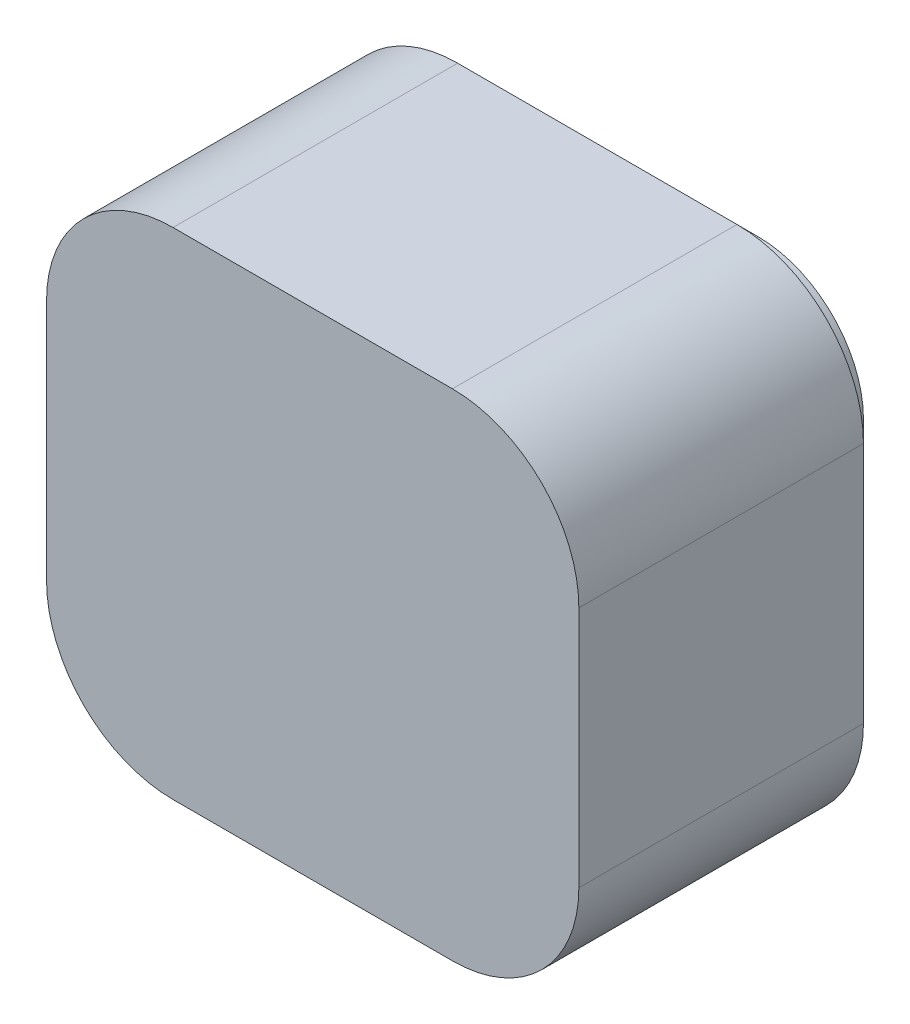
ISO-10303-21;
HEADER;
FILE_DESCRIPTION(('STEP AP214'),'2;1');
FILE_NAME('part.step','',(''),(''),'','','');
FILE_SCHEMA(('AUTOMOTIVE_DESIGN { 1 0 10303 214 1 1 1 1 }'));
ENDSEC;
DATA;
#1=APPLICATION_CONTEXT('core data for automotive mechanical design processes');
#2=APPLICATION_PROTOCOL_DEFINITION('international standard','automotive_design',2000,#1);
#3=PRODUCT_CONTEXT('',#1,'mechanical');
#4=PRODUCT('Part','Part','',(#3));
#5=PRODUCT_RELATED_PRODUCT_CATEGORY('part','',(#4));
#6=PRODUCT_DEFINITION_FORMATION('','',#4);
#7=PRODUCT_DEFINITION_CONTEXT('part definition',#1,'design');
#8=PRODUCT_DEFINITION('design','',#6,#7);
#9=PRODUCT_DEFINITION_SHAPE('','',#8);
#10=(LENGTH_UNIT() NAMED_UNIT(*) SI_UNIT(.MILLI.,.METRE.));
#11=(NAMED_UNIT(*) PLANE_ANGLE_UNIT() SI_UNIT($,.RADIAN.));
#12=(NAMED_UNIT(*) SI_UNIT($,.STERADIAN.) SOLID_ANGLE_UNIT());
#13=UNCERTAINTY_MEASURE_WITH_UNIT(LENGTH_MEASURE(1.E-05),#10,'distance_accuracy_value','');
#14=(GEOMETRIC_REPRESENTATION_CONTEXT(3) GLOBAL_UNCERTAINTY_ASSIGNED_CONTEXT((#13)) GLOBAL_UNIT_ASSIGNED_CONTEXT((#10,
#11,#12)) REPRESENTATION_CONTEXT('',''));
#15=CARTESIAN_POINT('',(0.,0.,0.));
#16=DIRECTION('',(0.,0.,1.));
#17=DIRECTION('',(1.,0.,0.));
#18=AXIS2_PLACEMENT_3D('',#15,#16,#17);
#19=CARTESIAN_POINT('',(-36.5,33.,0.));
#20=DIRECTION('',(0.,0.,-1.));
#21=DIRECTION('',(1.,0.,0.));
#22=AXIS2_PLACEMENT_3D('',#19,#20,#21);
#23=CONICAL_SURFACE('',#22,10.,0.174532925199433);
#24=CARTESIAN_POINT('',(-36.5,33.,0.));
#25=DIRECTION('',(0.,0.,1.));
#26=DIRECTION('',(1.,0.,0.));
#27=AXIS2_PLACEMENT_3D('',#24,#25,#26);
#28=CIRCLE('',#27,10.);
#29=CARTESIAN_POINT('',(-36.4999999999999,43.,0.));
#30=VERTEX_POINT('',#29);
#31=CARTESIAN_POINT('',(-46.5,32.9999999999999,0.));
#32=VERTEX_POINT('',#31);
#33=EDGE_CURVE('E178',#30,#32,#28,.T.);
#34=ORIENTED_EDGE('',*,*,#33,.T.);
#35=DIRECTION('',(-0.17364817766693,0.,-0.984807753012208));
#36=VECTOR('',#35,1.);
#37=CARTESIAN_POINT('',(-46.5,32.9999999999999,0.));
#38=LINE('',#37,#36);
#39=CARTESIAN_POINT('',(-46.1473460385831,32.9999999999999,2.));
#40=VERTEX_POINT('',#39);
#41=EDGE_CURVE('E12',#40,#32,#38,.T.);
#42=ORIENTED_EDGE('',*,*,#41,.F.);
#43=CARTESIAN_POINT('',(-36.5,33.,2.));
#44=DIRECTION('',(0.,0.,1.));
#45=DIRECTION('',(1.,0.,0.));
#46=AXIS2_PLACEMENT_3D('',#43,#44,#45);
#47=CIRCLE('',#46,9.64734603858307);
#48=CARTESIAN_POINT('',(-36.4999999999999,42.6473460385831,2.));
#49=VERTEX_POINT('',#48);
#50=EDGE_CURVE('E210',#49,#40,#47,.T.);
#51=ORIENTED_EDGE('',*,*,#50,.F.);
#52=DIRECTION('',(0.,0.17364817766693,-0.984807753012208));
#53=VECTOR('',#52,1.);
#54=CARTESIAN_POINT('',(-36.4999999999999,43.,0.));
#55=LINE('',#54,#53);
#56=EDGE_CURVE('E212',#49,#30,#55,.T.);
#57=ORIENTED_EDGE('',*,*,#56,.T.);
#58=EDGE_LOOP('',(#34,#42,#51,#57));
#59=FACE_BOUND('',#58,.T.);
#60=ADVANCED_FACE('F45',(#59),#23,.T.);
#61=CARTESIAN_POINT('',(-46.5,10.0000000000001,0.));
#62=DIRECTION('',(-0.984807753012208,0.,0.17364817766693));
#63=DIRECTION('',(0.17364817766693,0.,0.984807753012208));
#64=AXIS2_PLACEMENT_3D('',#61,#62,#63);
#65=PLANE('',#64);
#66=DIRECTION('',(0.,-1.,0.));
#67=VECTOR('',#66,1.);
#68=CARTESIAN_POINT('',(-46.5,10.0000000000001,0.));
#69=LINE('',#68,#67);
#70=CARTESIAN_POINT('',(-46.5,9.99999999999999,0.));
#71=VERTEX_POINT('',#70);
#72=EDGE_CURVE('E141',#32,#71,#69,.T.);
#73=ORIENTED_EDGE('',*,*,#72,.T.);
#74=DIRECTION('',(-0.17364817766693,0.,-0.984807753012208));
#75=VECTOR('',#74,1.);
#76=CARTESIAN_POINT('',(-46.5,9.99999999999999,0.));
#77=LINE('',#76,#75);
#78=CARTESIAN_POINT('',(-46.1473460385831,9.99999999999999,2.));
#79=VERTEX_POINT('',#78);
#80=EDGE_CURVE('E54',#79,#71,#77,.T.);
#81=ORIENTED_EDGE('',*,*,#80,.F.);
#82=DIRECTION('',(0.,1.,0.));
#83=VECTOR('',#82,1.);
#84=CARTESIAN_POINT('',(-46.1473460385831,10.0000000000001,2.));
#85=LINE('',#84,#83);
#86=EDGE_CURVE('E233',#40,#79,#85,.F.);
#87=ORIENTED_EDGE('',*,*,#86,.F.);
#88=ORIENTED_EDGE('',*,*,#41,.T.);
#89=EDGE_LOOP('',(#73,#81,#87,#88));
#90=FACE_BOUND('',#89,.T.);
#91=ADVANCED_FACE('F47',(#90),#65,.T.);
#92=CARTESIAN_POINT('',(-36.5,9.99999999999999,0.));
#93=DIRECTION('',(0.,0.,-1.));
#94=DIRECTION('',(-1.,0.,0.));
#95=AXIS2_PLACEMENT_3D('',#92,#93,#94);
#96=CONICAL_SURFACE('',#95,10.,0.174532925199433);
#97=CARTESIAN_POINT('',(-36.5,9.99999999999999,0.));
#98=DIRECTION('',(0.,0.,1.));
#99=DIRECTION('',(-1.,0.,0.));
#100=AXIS2_PLACEMENT_3D('',#97,#98,#99);
#101=CIRCLE('',#100,10.);
#102=CARTESIAN_POINT('',(-36.4999999999999,0.,0.));
#103=VERTEX_POINT('',#102);
#104=EDGE_CURVE('E193',#71,#103,#101,.T.);
#105=ORIENTED_EDGE('',*,*,#104,.T.);
#106=DIRECTION('',(0.,-0.17364817766693,-0.984807753012208));
#107=VECTOR('',#106,1.);
#108=CARTESIAN_POINT('',(-36.4999999999999,0.,0.));
#109=LINE('',#108,#107);
#110=CARTESIAN_POINT('',(-36.4999999999999,0.352653961416924,2.));
#111=VERTEX_POINT('',#110);
#112=EDGE_CURVE('E227',#111,#103,#109,.T.);
#113=ORIENTED_EDGE('',*,*,#112,.F.);
#114=CARTESIAN_POINT('',(-36.5,9.99999999999999,2.));
#115=DIRECTION('',(0.,0.,1.));
#116=DIRECTION('',(1.,0.,0.));
#117=AXIS2_PLACEMENT_3D('',#114,#115,#116);
#118=CIRCLE('',#117,9.64734603858307);
#119=EDGE_CURVE('E235',#79,#111,#118,.T.);
#120=ORIENTED_EDGE('',*,*,#119,.F.);
#121=ORIENTED_EDGE('',*,*,#80,.T.);
#122=EDGE_LOOP('',(#105,#113,#120,#121));
#123=FACE_BOUND('',#122,.T.);
#124=ADVANCED_FACE('F264',(#123),#96,.T.);
#125=CARTESIAN_POINT('',(-10.0000000000001,0.,0.));
#126=DIRECTION('',(0.,-0.984807753012208,0.17364817766693));
#127=DIRECTION('',(0.,-0.17364817766693,-0.984807753012208));
#128=AXIS2_PLACEMENT_3D('',#125,#126,#127);
#129=PLANE('',#128);
#130=DIRECTION('',(1.,0.,0.));
#131=VECTOR('',#130,1.);
#132=CARTESIAN_POINT('',(-10.0000000000001,0.,0.));
#133=LINE('',#132,#131);
#134=CARTESIAN_POINT('',(-10.0000000000001,0.,0.));
#135=VERTEX_POINT('',#134);
#136=EDGE_CURVE('E196',#103,#135,#133,.T.);
#137=ORIENTED_EDGE('',*,*,#136,.T.);
#138=DIRECTION('',(0.,-0.17364817766693,-0.984807753012208));
#139=VECTOR('',#138,1.);
#140=CARTESIAN_POINT('',(-10.0000000000001,0.,0.));
#141=LINE('',#140,#139);
#142=CARTESIAN_POINT('',(-10.0000000000001,0.352653961416928,2.));
#143=VERTEX_POINT('',#142);
#144=EDGE_CURVE('E224',#143,#135,#141,.T.);
#145=ORIENTED_EDGE('',*,*,#144,.F.);
#146=DIRECTION('',(-1.,0.,0.));
#147=VECTOR('',#146,1.);
#148=CARTESIAN_POINT('',(-10.0000000000001,0.352653961416928,2.));
#149=LINE('',#148,#147);
#150=EDGE_CURVE('E237',#111,#143,#149,.F.);
#151=ORIENTED_EDGE('',*,*,#150,.F.);
#152=ORIENTED_EDGE('',*,*,#112,.T.);
#153=EDGE_LOOP('',(#137,#145,#151,#152));
#154=FACE_BOUND('',#153,.T.);
#155=ADVANCED_FACE('F268',(#154),#129,.T.);
#156=CARTESIAN_POINT('',(-10.,10.,0.));
#157=DIRECTION('',(0.,0.,-1.));
#158=DIRECTION('',(1.,0.,0.));
#159=AXIS2_PLACEMENT_3D('',#156,#157,#158);
#160=CONICAL_SURFACE('',#159,10.,0.174532925199433);
#161=CARTESIAN_POINT('',(-10.,10.,0.));
#162=DIRECTION('',(0.,0.,1.));
#163=DIRECTION('',(1.,0.,0.));
#164=AXIS2_PLACEMENT_3D('',#161,#162,#163);
#165=CIRCLE('',#164,10.);
#166=CARTESIAN_POINT('',(0.,10.0000000000001,0.));
#167=VERTEX_POINT('',#166);
#168=EDGE_CURVE('E199',#135,#167,#165,.T.);
#169=ORIENTED_EDGE('',*,*,#168,.T.);
#170=DIRECTION('',(0.17364817766693,0.,-0.984807753012208));
#171=VECTOR('',#170,1.);
#172=CARTESIAN_POINT('',(0.,10.0000000000001,0.));
#173=LINE('',#172,#171);
#174=CARTESIAN_POINT('',(-0.35265396141693,10.0000000000001,2.));
#175=VERTEX_POINT('',#174);
#176=EDGE_CURVE('E221',#175,#167,#173,.T.);
#177=ORIENTED_EDGE('',*,*,#176,.F.);
#178=CARTESIAN_POINT('',(-10.,10.,2.));
#179=DIRECTION('',(0.,0.,1.));
#180=DIRECTION('',(1.,0.,0.));
#181=AXIS2_PLACEMENT_3D('',#178,#179,#180);
#182=CIRCLE('',#181,9.64734603858307);
#183=EDGE_CURVE('E239',#143,#175,#182,.T.);
#184=ORIENTED_EDGE('',*,*,#183,.F.);
#185=ORIENTED_EDGE('',*,*,#144,.T.);
#186=EDGE_LOOP('',(#169,#177,#184,#185));
#187=FACE_BOUND('',#186,.T.);
#188=ADVANCED_FACE('F271',(#187),#160,.T.);
#189=CARTESIAN_POINT('',(0.,10.0000000000001,0.));
#190=DIRECTION('',(0.984807753012208,0.,0.17364817766693));
#191=DIRECTION('',(0.17364817766693,0.,-0.984807753012208));
#192=AXIS2_PLACEMENT_3D('',#189,#190,#191);
#193=PLANE('',#192);
#194=DIRECTION('',(0.,1.,0.));
#195=VECTOR('',#194,1.);
#196=CARTESIAN_POINT('',(0.,10.0000000000001,0.));
#197=LINE('',#196,#195);
#198=CARTESIAN_POINT('',(0.,32.9999999999999,0.));
#199=VERTEX_POINT('',#198);
#200=EDGE_CURVE('E202',#167,#199,#197,.T.);
#201=ORIENTED_EDGE('',*,*,#200,.T.);
#202=DIRECTION('',(0.17364817766693,0.,-0.984807753012208));
#203=VECTOR('',#202,1.);
#204=CARTESIAN_POINT('',(0.,32.9999999999999,0.));
#205=LINE('',#204,#203);
#206=CARTESIAN_POINT('',(-0.35265396141693,32.9999999999999,2.));
#207=VERTEX_POINT('',#206);
#208=EDGE_CURVE('E218',#207,#199,#205,.T.);
#209=ORIENTED_EDGE('',*,*,#208,.F.);
#210=DIRECTION('',(0.,-1.,0.));
#211=VECTOR('',#210,1.);
#212=CARTESIAN_POINT('',(-0.35265396141693,10.0000000000001,2.));
#213=LINE('',#212,#211);
#214=EDGE_CURVE('E241',#175,#207,#213,.F.);
#215=ORIENTED_EDGE('',*,*,#214,.F.);
#216=ORIENTED_EDGE('',*,*,#176,.T.);
#217=EDGE_LOOP('',(#201,#209,#215,#216));
#218=FACE_BOUND('',#217,.T.);
#219=ADVANCED_FACE('F248',(#218),#193,.T.);
#220=CARTESIAN_POINT('',(-10.,33.,0.));
#221=DIRECTION('',(0.,0.,-1.));
#222=DIRECTION('',(1.,0.,0.));
#223=AXIS2_PLACEMENT_3D('',#220,#221,#222);
#224=CONICAL_SURFACE('',#223,10.,0.174532925199433);
#225=CARTESIAN_POINT('',(-10.,33.,0.));
#226=DIRECTION('',(0.,0.,1.));
#227=DIRECTION('',(1.,0.,0.));
#228=AXIS2_PLACEMENT_3D('',#225,#226,#227);
#229=CIRCLE('',#228,10.);
#230=CARTESIAN_POINT('',(-10.0000000000001,43.,0.));
#231=VERTEX_POINT('',#230);
#232=EDGE_CURVE('E205',#199,#231,#229,.T.);
#233=ORIENTED_EDGE('',*,*,#232,.T.);
#234=DIRECTION('',(0.,0.17364817766693,-0.984807753012208));
#235=VECTOR('',#234,1.);
#236=CARTESIAN_POINT('',(-10.0000000000001,43.,0.));
#237=LINE('',#236,#235);
#238=CARTESIAN_POINT('',(-10.0000000000001,42.6473460385831,2.));
#239=VERTEX_POINT('',#238);
#240=EDGE_CURVE('E215',#239,#231,#237,.T.);
#241=ORIENTED_EDGE('',*,*,#240,.F.);
#242=CARTESIAN_POINT('',(-10.,33.,2.));
#243=DIRECTION('',(0.,0.,1.));
#244=DIRECTION('',(1.,0.,0.));
#245=AXIS2_PLACEMENT_3D('',#242,#243,#244);
#246=CIRCLE('',#245,9.64734603858307);
#247=EDGE_CURVE('E66',#207,#239,#246,.T.);
#248=ORIENTED_EDGE('',*,*,#247,.F.);
#249=ORIENTED_EDGE('',*,*,#208,.T.);
#250=EDGE_LOOP('',(#233,#241,#248,#249));
#251=FACE_BOUND('',#250,.T.);
#252=ADVANCED_FACE('F251',(#251),#224,.T.);
#253=CARTESIAN_POINT('',(-10.0000000000001,43.,0.));
#254=DIRECTION('',(0.,0.984807753012208,0.17364817766693));
#255=DIRECTION('',(0.,-0.17364817766693,0.984807753012208));
#256=AXIS2_PLACEMENT_3D('',#253,#254,#255);
#257=PLANE('',#256);
#258=DIRECTION('',(-1.,0.,0.));
#259=VECTOR('',#258,1.);
#260=CARTESIAN_POINT('',(-10.0000000000001,43.,0.));
#261=LINE('',#260,#259);
#262=EDGE_CURVE('E208',#231,#30,#261,.T.);
#263=ORIENTED_EDGE('',*,*,#262,.T.);
#264=ORIENTED_EDGE('',*,*,#56,.F.);
#265=DIRECTION('',(1.,0.,0.));
#266=VECTOR('',#265,1.);
#267=CARTESIAN_POINT('',(-10.0000000000001,42.6473460385831,2.));
#268=LINE('',#267,#266);
#269=EDGE_CURVE('E49',#239,#49,#268,.F.);
#270=ORIENTED_EDGE('',*,*,#269,.F.);
#271=ORIENTED_EDGE('',*,*,#240,.T.);
#272=EDGE_LOOP('',(#263,#264,#270,#271));
#273=FACE_BOUND('',#272,.T.);
#274=ADVANCED_FACE('F254',(#273),#257,.T.);
#275=CARTESIAN_POINT('',(-36.5,33.,2.));
#276=DIRECTION('',(0.,0.,1.));
#277=DIRECTION('',(1.,0.,0.));
#278=AXIS2_PLACEMENT_3D('',#275,#276,#277);
#279=PLANE('',#278);
#280=ORIENTED_EDGE('',*,*,#50,.T.);
#281=ORIENTED_EDGE('',*,*,#86,.T.);
#282=ORIENTED_EDGE('',*,*,#119,.T.);
#283=ORIENTED_EDGE('',*,*,#150,.T.);
#284=ORIENTED_EDGE('',*,*,#183,.T.);
#285=ORIENTED_EDGE('',*,*,#214,.T.);
#286=ORIENTED_EDGE('',*,*,#247,.T.);
#287=ORIENTED_EDGE('',*,*,#269,.T.);
#288=EDGE_LOOP('',(#280,#281,#282,#283,#284,#285,#286,#287));
#289=FACE_BOUND('',#288,.T.);
#290=ADVANCED_FACE('F244',(#289),#279,.T.);
#291=CARTESIAN_POINT('',(-36.5,33.,-2.));
#292=DIRECTION('',(0.,0.,1.));
#293=DIRECTION('',(1.,0.,0.));
#294=AXIS2_PLACEMENT_3D('',#291,#292,#293);
#295=CYLINDRICAL_SURFACE('',#294,10.);
#296=ORIENTED_EDGE('',*,*,#33,.F.);
#297=DIRECTION('',(0.,0.,1.));
#298=VECTOR('',#297,1.);
#299=CARTESIAN_POINT('',(-36.4999999999999,43.,-2.));
#300=LINE('',#299,#298);
#301=CARTESIAN_POINT('',(-36.4999999999999,43.,-2.));
#302=VERTEX_POINT('',#301);
#303=EDGE_CURVE('E160',#302,#30,#300,.T.);
#304=ORIENTED_EDGE('',*,*,#303,.F.);
#305=CARTESIAN_POINT('',(-36.5,33.,-2.));
#306=DIRECTION('',(0.,0.,1.));
#307=DIRECTION('',(1.,0.,0.));
#308=AXIS2_PLACEMENT_3D('',#305,#306,#307);
#309=CIRCLE('',#308,10.);
#310=CARTESIAN_POINT('',(-46.5,32.9999999999999,-2.));
#311=VERTEX_POINT('',#310);
#312=EDGE_CURVE('E153',#302,#311,#309,.T.);
#313=ORIENTED_EDGE('',*,*,#312,.T.);
#314=DIRECTION('',(0.,0.,1.));
#315=VECTOR('',#314,1.);
#316=CARTESIAN_POINT('',(-46.5,32.9999999999999,-2.));
#317=LINE('',#316,#315);
#318=EDGE_CURVE('E135',#311,#32,#317,.T.);
#319=ORIENTED_EDGE('',*,*,#318,.T.);
#320=EDGE_LOOP('',(#296,#304,#313,#319));
#321=FACE_BOUND('',#320,.T.);
#322=ADVANCED_FACE('F159',(#321),#295,.T.);
#323=CARTESIAN_POINT('',(-10.0000000000001,43.,-2.));
#324=DIRECTION('',(0.,1.,0.));
#325=DIRECTION('',(-1.,0.,0.));
#326=AXIS2_PLACEMENT_3D('',#323,#324,#325);
#327=PLANE('',#326);
#328=ORIENTED_EDGE('',*,*,#262,.F.);
#329=DIRECTION('',(0.,0.,1.));
#330=VECTOR('',#329,1.);
#331=CARTESIAN_POINT('',(-10.0000000000001,43.,-2.));
#332=LINE('',#331,#330);
#333=CARTESIAN_POINT('',(-10.0000000000001,43.,-2.));
#334=VERTEX_POINT('',#333);
#335=EDGE_CURVE('E179',#334,#231,#332,.T.);
#336=ORIENTED_EDGE('',*,*,#335,.F.);
#337=DIRECTION('',(-1.,0.,0.));
#338=VECTOR('',#337,1.);
#339=CARTESIAN_POINT('',(-10.0000000000001,43.,-2.));
#340=LINE('',#339,#338);
#341=EDGE_CURVE('E146',#334,#302,#340,.T.);
#342=ORIENTED_EDGE('',*,*,#341,.T.);
#343=ORIENTED_EDGE('',*,*,#303,.T.);
#344=EDGE_LOOP('',(#328,#336,#342,#343));
#345=FACE_BOUND('',#344,.T.);
#346=ADVANCED_FACE('F283',(#345),#327,.T.);
#347=CARTESIAN_POINT('',(-10.,33.,-2.));
#348=DIRECTION('',(0.,0.,1.));
#349=DIRECTION('',(1.,0.,0.));
#350=AXIS2_PLACEMENT_3D('',#347,#348,#349);
#351=CYLINDRICAL_SURFACE('',#350,10.);
#352=ORIENTED_EDGE('',*,*,#232,.F.);
#353=DIRECTION('',(0.,0.,1.));
#354=VECTOR('',#353,1.);
#355=CARTESIAN_POINT('',(0.,32.9999999999999,-2.));
#356=LINE('',#355,#354);
#357=CARTESIAN_POINT('',(0.,32.9999999999999,-2.));
#358=VERTEX_POINT('',#357);
#359=EDGE_CURVE('E181',#358,#199,#356,.T.);
#360=ORIENTED_EDGE('',*,*,#359,.F.);
#361=CARTESIAN_POINT('',(-10.,33.,-2.));
#362=DIRECTION('',(0.,0.,1.));
#363=DIRECTION('',(1.,0.,0.));
#364=AXIS2_PLACEMENT_3D('',#361,#362,#363);
#365=CIRCLE('',#364,10.);
#366=EDGE_CURVE('E173',#358,#334,#365,.T.);
#367=ORIENTED_EDGE('',*,*,#366,.T.);
#368=ORIENTED_EDGE('',*,*,#335,.T.);
#369=EDGE_LOOP('',(#352,#360,#367,#368));
#370=FACE_BOUND('',#369,.T.);
#371=ADVANCED_FACE('F281',(#370),#351,.T.);
#372=CARTESIAN_POINT('',(0.,10.0000000000001,-2.));
#373=DIRECTION('',(1.,0.,0.));
#374=DIRECTION('',(0.,0.,-1.));
#375=AXIS2_PLACEMENT_3D('',#372,#373,#374);
#376=PLANE('',#375);
#377=ORIENTED_EDGE('',*,*,#200,.F.);
#378=DIRECTION('',(0.,0.,1.));
#379=VECTOR('',#378,1.);
#380=CARTESIAN_POINT('',(0.,10.0000000000001,-2.));
#381=LINE('',#380,#379);
#382=CARTESIAN_POINT('',(0.,10.0000000000001,-2.));
#383=VERTEX_POINT('',#382);
#384=EDGE_CURVE('E183',#383,#167,#381,.T.);
#385=ORIENTED_EDGE('',*,*,#384,.F.);
#386=DIRECTION('',(0.,1.,0.));
#387=VECTOR('',#386,1.);
#388=CARTESIAN_POINT('',(0.,10.0000000000001,-2.));
#389=LINE('',#388,#387);
#390=EDGE_CURVE('E170',#383,#358,#389,.T.);
#391=ORIENTED_EDGE('',*,*,#390,.T.);
#392=ORIENTED_EDGE('',*,*,#359,.T.);
#393=EDGE_LOOP('',(#377,#385,#391,#392));
#394=FACE_BOUND('',#393,.T.);
#395=ADVANCED_FACE('F278',(#394),#376,.T.);
#396=CARTESIAN_POINT('',(-10.,10.,-2.));
#397=DIRECTION('',(0.,0.,1.));
#398=DIRECTION('',(1.,0.,0.));
#399=AXIS2_PLACEMENT_3D('',#396,#397,#398);
#400=CYLINDRICAL_SURFACE('',#399,10.);
#401=ORIENTED_EDGE('',*,*,#168,.F.);
#402=DIRECTION('',(0.,0.,1.));
#403=VECTOR('',#402,1.);
#404=CARTESIAN_POINT('',(-10.0000000000001,0.,-2.));
#405=LINE('',#404,#403);
#406=CARTESIAN_POINT('',(-10.0000000000001,0.,-2.));
#407=VERTEX_POINT('',#406);
#408=EDGE_CURVE('E185',#407,#135,#405,.T.);
#409=ORIENTED_EDGE('',*,*,#408,.F.);
#410=CARTESIAN_POINT('',(-10.,10.,-2.));
#411=DIRECTION('',(0.,0.,1.));
#412=DIRECTION('',(1.,0.,0.));
#413=AXIS2_PLACEMENT_3D('',#410,#411,#412);
#414=CIRCLE('',#413,10.);
#415=EDGE_CURVE('E167',#407,#383,#414,.T.);
#416=ORIENTED_EDGE('',*,*,#415,.T.);
#417=ORIENTED_EDGE('',*,*,#384,.T.);
#418=EDGE_LOOP('',(#401,#409,#416,#417));
#419=FACE_BOUND('',#418,.T.);
#420=ADVANCED_FACE('F274',(#419),#400,.T.);
#421=CARTESIAN_POINT('',(-10.0000000000001,0.,-2.));
#422=DIRECTION('',(0.,-1.,0.));
#423=DIRECTION('',(1.,0.,0.));
#424=AXIS2_PLACEMENT_3D('',#421,#422,#423);
#425=PLANE('',#424);
#426=ORIENTED_EDGE('',*,*,#136,.F.);
#427=DIRECTION('',(0.,0.,1.));
#428=VECTOR('',#427,1.);
#429=CARTESIAN_POINT('',(-36.4999999999999,0.,-2.));
#430=LINE('',#429,#428);
#431=CARTESIAN_POINT('',(-36.4999999999999,0.,-2.));
#432=VERTEX_POINT('',#431);
#433=EDGE_CURVE('E187',#432,#103,#430,.T.);
#434=ORIENTED_EDGE('',*,*,#433,.F.);
#435=DIRECTION('',(1.,0.,0.));
#436=VECTOR('',#435,1.);
#437=CARTESIAN_POINT('',(-10.0000000000001,0.,-2.));
#438=LINE('',#437,#436);
#439=EDGE_CURVE('E164',#432,#407,#438,.T.);
#440=ORIENTED_EDGE('',*,*,#439,.T.);
#441=ORIENTED_EDGE('',*,*,#408,.T.);
#442=EDGE_LOOP('',(#426,#434,#440,#441));
#443=FACE_BOUND('',#442,.T.);
#444=ADVANCED_FACE('F285',(#443),#425,.T.);
#445=CARTESIAN_POINT('',(-36.5,9.99999999999999,-2.));
#446=DIRECTION('',(0.,0.,1.));
#447=DIRECTION('',(1.,0.,0.));
#448=AXIS2_PLACEMENT_3D('',#445,#446,#447);
#449=CYLINDRICAL_SURFACE('',#448,10.);
#450=ORIENTED_EDGE('',*,*,#104,.F.);
#451=DIRECTION('',(0.,0.,1.));
#452=VECTOR('',#451,1.);
#453=CARTESIAN_POINT('',(-46.5,9.99999999999999,-2.));
#454=LINE('',#453,#452);
#455=CARTESIAN_POINT('',(-46.5,9.99999999999999,-2.));
#456=VERTEX_POINT('',#455);
#457=EDGE_CURVE('E145',#456,#71,#454,.T.);
#458=ORIENTED_EDGE('',*,*,#457,.F.);
#459=CARTESIAN_POINT('',(-36.5,9.99999999999999,-2.));
#460=DIRECTION('',(0.,0.,1.));
#461=DIRECTION('',(-1.,0.,0.));
#462=AXIS2_PLACEMENT_3D('',#459,#460,#461);
#463=CIRCLE('',#462,10.);
#464=EDGE_CURVE('E157',#456,#432,#463,.T.);
#465=ORIENTED_EDGE('',*,*,#464,.T.);
#466=ORIENTED_EDGE('',*,*,#433,.T.);
#467=EDGE_LOOP('',(#450,#458,#465,#466));
#468=FACE_BOUND('',#467,.T.);
#469=ADVANCED_FACE('F287',(#468),#449,.T.);
#470=CARTESIAN_POINT('',(-46.5,10.0000000000001,-2.));
#471=DIRECTION('',(-1.,0.,0.));
#472=DIRECTION('',(0.,0.,1.));
#473=AXIS2_PLACEMENT_3D('',#470,#471,#472);
#474=PLANE('',#473);
#475=ORIENTED_EDGE('',*,*,#72,.F.);
#476=ORIENTED_EDGE('',*,*,#318,.F.);
#477=DIRECTION('',(0.,-1.,0.));
#478=VECTOR('',#477,1.);
#479=CARTESIAN_POINT('',(-46.5,10.0000000000001,-2.));
#480=LINE('',#479,#478);
#481=EDGE_CURVE('E139',#311,#456,#480,.T.);
#482=ORIENTED_EDGE('',*,*,#481,.T.);
#483=ORIENTED_EDGE('',*,*,#457,.T.);
#484=EDGE_LOOP('',(#475,#476,#482,#483));
#485=FACE_BOUND('',#484,.T.);
#486=ADVANCED_FACE('F137',(#485),#474,.T.);
#487=CARTESIAN_POINT('',(-36.5,33.,-2.));
#488=DIRECTION('',(0.,0.,1.));
#489=DIRECTION('',(1.,0.,0.));
#490=AXIS2_PLACEMENT_3D('',#487,#488,#489);
#491=PLANE('',#490);
#492=ORIENTED_EDGE('',*,*,#312,.F.);
#493=ORIENTED_EDGE('',*,*,#341,.F.);
#494=ORIENTED_EDGE('',*,*,#366,.F.);
#495=ORIENTED_EDGE('',*,*,#390,.F.);
#496=ORIENTED_EDGE('',*,*,#415,.F.);
#497=ORIENTED_EDGE('',*,*,#439,.F.);
#498=ORIENTED_EDGE('',*,*,#464,.F.);
#499=ORIENTED_EDGE('',*,*,#481,.F.);
#500=EDGE_LOOP('',(#492,#493,#494,#495,#496,#497,#498,#499));
#501=FACE_BOUND('',#500,.T.);
#502=ADVANCED_FACE('F151',(#501),#491,.F.);
#503=CLOSED_SHELL('',(#60,#91,#124,#155,#188,#219,#252,#274,#290,#322,#346,#371,#395,#420,#444,
#469,#486,#502));
#504=MANIFOLD_SOLID_BREP('B2',#503);
#505=CARTESIAN_POINT('',(-36.5,33.,25.));
#506=DIRECTION('',(0.,0.,-1.));
#507=DIRECTION('',(-1.,0.,0.));
#508=AXIS2_PLACEMENT_3D('',#505,#506,#507);
#509=CYLINDRICAL_SURFACE('',#508,12.);
#510=CARTESIAN_POINT('',(-36.5,33.,0.));
#511=DIRECTION('',(0.,0.,1.));
#512=DIRECTION('',(1.,0.,0.));
#513=AXIS2_PLACEMENT_3D('',#510,#511,#512);
#514=CIRCLE('',#513,12.);
#515=CARTESIAN_POINT('',(-36.4999999999999,45.,0.));
#516=VERTEX_POINT('',#515);
#517=CARTESIAN_POINT('',(-48.5,32.9999999999999,0.));
#518=VERTEX_POINT('',#517);
#519=EDGE_CURVE('E569',#516,#518,#514,.T.);
#520=ORIENTED_EDGE('',*,*,#519,.T.);
#521=DIRECTION('',(0.,0.,-1.));
#522=VECTOR('',#521,1.);
#523=CARTESIAN_POINT('',(-48.5,32.9999999999999,25.));
#524=LINE('',#523,#522);
#525=CARTESIAN_POINT('',(-48.5,32.9999999999999,27.));
#526=VERTEX_POINT('',#525);
#527=EDGE_CURVE('E43',#526,#518,#524,.T.);
#528=ORIENTED_EDGE('',*,*,#527,.F.);
#529=CARTESIAN_POINT('',(-36.5,33.,27.));
#530=DIRECTION('',(0.,0.,1.));
#531=DIRECTION('',(1.,0.,0.));
#532=AXIS2_PLACEMENT_3D('',#529,#530,#531);
#533=CIRCLE('',#532,12.);
#534=CARTESIAN_POINT('',(-36.4999999999999,45.,27.));
#535=VERTEX_POINT('',#534);
#536=EDGE_CURVE('E575',#535,#526,#533,.T.);
#537=ORIENTED_EDGE('',*,*,#536,.F.);
#538=DIRECTION('',(0.,0.,-1.));
#539=VECTOR('',#538,1.);
#540=CARTESIAN_POINT('',(-36.4999999999999,45.,25.));
#541=LINE('',#540,#539);
#542=EDGE_CURVE('E565',#535,#516,#541,.T.);
#543=ORIENTED_EDGE('',*,*,#542,.T.);
#544=EDGE_LOOP('',(#520,#528,#537,#543));
#545=FACE_BOUND('',#544,.T.);
#546=ADVANCED_FACE('F433',(#545),#509,.T.);
#547=CARTESIAN_POINT('',(-48.5,10.0000000000001,25.));
#548=DIRECTION('',(1.,0.,0.));
#549=DIRECTION('',(0.,0.,-1.));
#550=AXIS2_PLACEMENT_3D('',#547,#548,#549);
#551=PLANE('',#550);
#552=DIRECTION('',(0.,-1.,0.));
#553=VECTOR('',#552,1.);
#554=CARTESIAN_POINT('',(-48.5,10.0000000000001,0.));
#555=LINE('',#554,#553);
#556=CARTESIAN_POINT('',(-48.5,9.99999999999999,0.));
#557=VERTEX_POINT('',#556);
#558=EDGE_CURVE('E437',#518,#557,#555,.T.);
#559=ORIENTED_EDGE('',*,*,#558,.T.);
#560=DIRECTION('',(0.,0.,-1.));
#561=VECTOR('',#560,1.);
#562=CARTESIAN_POINT('',(-48.5,9.99999999999999,25.));
#563=LINE('',#562,#561);
#564=CARTESIAN_POINT('',(-48.5,9.99999999999999,27.));
#565=VERTEX_POINT('',#564);
#566=EDGE_CURVE('E442',#565,#557,#563,.T.);
#567=ORIENTED_EDGE('',*,*,#566,.F.);
#568=DIRECTION('',(0.,-1.,0.));
#569=VECTOR('',#568,1.);
#570=CARTESIAN_POINT('',(-48.5,10.0000000000001,27.));
#571=LINE('',#570,#569);
#572=EDGE_CURVE('E614',#526,#565,#571,.T.);
#573=ORIENTED_EDGE('',*,*,#572,.F.);
#574=ORIENTED_EDGE('',*,*,#527,.T.);
#575=EDGE_LOOP('',(#559,#567,#573,#574));
#576=FACE_BOUND('',#575,.T.);
#577=ADVANCED_FACE('F589',(#576),#551,.F.);
#578=CARTESIAN_POINT('',(-36.5,9.99999999999999,25.));
#579=DIRECTION('',(0.,0.,-1.));
#580=DIRECTION('',(-1.,0.,0.));
#581=AXIS2_PLACEMENT_3D('',#578,#579,#580);
#582=CYLINDRICAL_SURFACE('',#581,12.);
#583=CARTESIAN_POINT('',(-36.5,9.99999999999999,0.));
#584=DIRECTION('',(0.,0.,1.));
#585=DIRECTION('',(1.,0.,0.));
#586=AXIS2_PLACEMENT_3D('',#583,#584,#585);
#587=CIRCLE('',#586,12.);
#588=CARTESIAN_POINT('',(-36.4999999999999,-2.,0.));
#589=VERTEX_POINT('',#588);
#590=EDGE_CURVE('E582',#557,#589,#587,.T.);
#591=ORIENTED_EDGE('',*,*,#590,.T.);
#592=DIRECTION('',(0.,0.,1.));
#593=VECTOR('',#592,1.);
#594=CARTESIAN_POINT('',(-36.4999999999999,-2.00000000000001,25.));
#595=LINE('',#594,#593);
#596=CARTESIAN_POINT('',(-36.4999999999999,-2.00000000000001,27.));
#597=VERTEX_POINT('',#596);
#598=EDGE_CURVE('E594',#597,#589,#595,.F.);
#599=ORIENTED_EDGE('',*,*,#598,.F.);
#600=CARTESIAN_POINT('',(-36.5,9.99999999999999,27.));
#601=DIRECTION('',(0.,0.,1.));
#602=DIRECTION('',(1.,0.,0.));
#603=AXIS2_PLACEMENT_3D('',#600,#601,#602);
#604=CIRCLE('',#603,12.);
#605=EDGE_CURVE('E593',#565,#597,#604,.T.);
#606=ORIENTED_EDGE('',*,*,#605,.F.);
#607=ORIENTED_EDGE('',*,*,#566,.T.);
#608=EDGE_LOOP('',(#591,#599,#606,#607));
#609=FACE_BOUND('',#608,.T.);
#610=ADVANCED_FACE('F592',(#609),#582,.T.);
#611=CARTESIAN_POINT('',(-10.0000000000001,-2.,25.));
#612=DIRECTION('',(0.,1.,0.));
#613=DIRECTION('',(-1.,0.,0.));
#614=AXIS2_PLACEMENT_3D('',#611,#612,#613);
#615=PLANE('',#614);
#616=DIRECTION('',(1.,0.,0.));
#617=VECTOR('',#616,1.);
#618=CARTESIAN_POINT('',(-10.0000000000001,-2.,0.));
#619=LINE('',#618,#617);
#620=CARTESIAN_POINT('',(-10.0000000000001,-2.,0.));
#621=VERTEX_POINT('',#620);
#622=EDGE_CURVE('E581',#589,#621,#619,.T.);
#623=ORIENTED_EDGE('',*,*,#622,.T.);
#624=DIRECTION('',(0.,0.,-1.));
#625=VECTOR('',#624,1.);
#626=CARTESIAN_POINT('',(-10.0000000000001,-2.,25.));
#627=LINE('',#626,#625);
#628=CARTESIAN_POINT('',(-10.0000000000001,-2.,27.));
#629=VERTEX_POINT('',#628);
#630=EDGE_CURVE('E604',#629,#621,#627,.T.);
#631=ORIENTED_EDGE('',*,*,#630,.F.);
#632=DIRECTION('',(1.,0.,0.));
#633=VECTOR('',#632,1.);
#634=CARTESIAN_POINT('',(-10.0000000000001,-2.,27.));
#635=LINE('',#634,#633);
#636=EDGE_CURVE('E612',#597,#629,#635,.T.);
#637=ORIENTED_EDGE('',*,*,#636,.F.);
#638=ORIENTED_EDGE('',*,*,#598,.T.);
#639=EDGE_LOOP('',(#623,#631,#637,#638));
#640=FACE_BOUND('',#639,.T.);
#641=ADVANCED_FACE('F602',(#640),#615,.F.);
#642=CARTESIAN_POINT('',(-10.,10.,25.));
#643=DIRECTION('',(0.,0.,-1.));
#644=DIRECTION('',(-1.,0.,0.));
#645=AXIS2_PLACEMENT_3D('',#642,#643,#644);
#646=CYLINDRICAL_SURFACE('',#645,12.);
#647=CARTESIAN_POINT('',(-10.,10.,0.));
#648=DIRECTION('',(0.,0.,1.));
#649=DIRECTION('',(1.,0.,0.));
#650=AXIS2_PLACEMENT_3D('',#647,#648,#649);
#651=CIRCLE('',#650,12.);
#652=CARTESIAN_POINT('',(2.,10.0000000000001,0.));
#653=VERTEX_POINT('',#652);
#654=EDGE_CURVE('E579',#621,#653,#651,.T.);
#655=ORIENTED_EDGE('',*,*,#654,.T.);
#656=DIRECTION('',(0.,0.,1.));
#657=VECTOR('',#656,1.);
#658=CARTESIAN_POINT('',(2.,10.0000000000001,25.));
#659=LINE('',#658,#657);
#660=CARTESIAN_POINT('',(2.,10.0000000000001,27.));
#661=VERTEX_POINT('',#660);
#662=EDGE_CURVE('E559',#661,#653,#659,.F.);
#663=ORIENTED_EDGE('',*,*,#662,.F.);
#664=CARTESIAN_POINT('',(-10.,10.,27.));
#665=DIRECTION('',(0.,0.,1.));
#666=DIRECTION('',(1.,0.,0.));
#667=AXIS2_PLACEMENT_3D('',#664,#665,#666);
#668=CIRCLE('',#667,12.);
#669=EDGE_CURVE('E547',#629,#661,#668,.T.);
#670=ORIENTED_EDGE('',*,*,#669,.F.);
#671=ORIENTED_EDGE('',*,*,#630,.T.);
#672=EDGE_LOOP('',(#655,#663,#670,#671));
#673=FACE_BOUND('',#672,.T.);
#674=ADVANCED_FACE('F606',(#673),#646,.T.);
#675=CARTESIAN_POINT('',(2.,10.0000000000001,25.));
#676=DIRECTION('',(-1.,0.,0.));
#677=DIRECTION('',(0.,0.,1.));
#678=AXIS2_PLACEMENT_3D('',#675,#676,#677);
#679=PLANE('',#678);
#680=DIRECTION('',(0.,1.,0.));
#681=VECTOR('',#680,1.);
#682=CARTESIAN_POINT('',(2.,10.0000000000001,0.));
#683=LINE('',#682,#681);
#684=CARTESIAN_POINT('',(2.,32.9999999999999,0.));
#685=VERTEX_POINT('',#684);
#686=EDGE_CURVE('E556',#653,#685,#683,.T.);
#687=ORIENTED_EDGE('',*,*,#686,.T.);
#688=DIRECTION('',(0.,0.,-1.));
#689=VECTOR('',#688,1.);
#690=CARTESIAN_POINT('',(2.,32.9999999999999,25.));
#691=LINE('',#690,#689);
#692=CARTESIAN_POINT('',(2.,32.9999999999999,27.));
#693=VERTEX_POINT('',#692);
#694=EDGE_CURVE('E553',#693,#685,#691,.T.);
#695=ORIENTED_EDGE('',*,*,#694,.F.);
#696=DIRECTION('',(0.,1.,0.));
#697=VECTOR('',#696,1.);
#698=CARTESIAN_POINT('',(2.,10.0000000000001,27.));
#699=LINE('',#698,#697);
#700=EDGE_CURVE('E541',#661,#693,#699,.T.);
#701=ORIENTED_EDGE('',*,*,#700,.F.);
#702=ORIENTED_EDGE('',*,*,#662,.T.);
#703=EDGE_LOOP('',(#687,#695,#701,#702));
#704=FACE_BOUND('',#703,.T.);
#705=ADVANCED_FACE('F554',(#704),#679,.F.);
#706=CARTESIAN_POINT('',(-10.,33.,25.));
#707=DIRECTION('',(0.,0.,-1.));
#708=DIRECTION('',(-1.,0.,0.));
#709=AXIS2_PLACEMENT_3D('',#706,#707,#708);
#710=CYLINDRICAL_SURFACE('',#709,12.);
#711=CARTESIAN_POINT('',(-10.,33.,0.));
#712=DIRECTION('',(0.,0.,1.));
#713=DIRECTION('',(1.,0.,0.));
#714=AXIS2_PLACEMENT_3D('',#711,#712,#713);
#715=CIRCLE('',#714,12.);
#716=CARTESIAN_POINT('',(-10.0000000000001,45.,0.));
#717=VERTEX_POINT('',#716);
#718=EDGE_CURVE('E576',#685,#717,#715,.T.);
#719=ORIENTED_EDGE('',*,*,#718,.T.);
#720=DIRECTION('',(0.,0.,1.));
#721=VECTOR('',#720,1.);
#722=CARTESIAN_POINT('',(-10.0000000000001,45.,25.));
#723=LINE('',#722,#721);
#724=CARTESIAN_POINT('',(-10.0000000000001,45.,27.));
#725=VERTEX_POINT('',#724);
#726=EDGE_CURVE('E560',#725,#717,#723,.F.);
#727=ORIENTED_EDGE('',*,*,#726,.F.);
#728=CARTESIAN_POINT('',(-10.,33.,27.));
#729=DIRECTION('',(0.,0.,1.));
#730=DIRECTION('',(1.,0.,0.));
#731=AXIS2_PLACEMENT_3D('',#728,#729,#730);
#732=CIRCLE('',#731,12.);
#733=EDGE_CURVE('E544',#693,#725,#732,.T.);
#734=ORIENTED_EDGE('',*,*,#733,.F.);
#735=ORIENTED_EDGE('',*,*,#694,.T.);
#736=EDGE_LOOP('',(#719,#727,#734,#735));
#737=FACE_BOUND('',#736,.T.);
#738=ADVANCED_FACE('F562',(#737),#710,.T.);
#739=CARTESIAN_POINT('',(-10.0000000000001,45.,25.));
#740=DIRECTION('',(0.,-1.,0.));
#741=DIRECTION('',(1.,0.,0.));
#742=AXIS2_PLACEMENT_3D('',#739,#740,#741);
#743=PLANE('',#742);
#744=DIRECTION('',(-1.,0.,0.));
#745=VECTOR('',#744,1.);
#746=CARTESIAN_POINT('',(-10.0000000000001,45.,0.));
#747=LINE('',#746,#745);
#748=EDGE_CURVE('E573',#717,#516,#747,.T.);
#749=ORIENTED_EDGE('',*,*,#748,.T.);
#750=ORIENTED_EDGE('',*,*,#542,.F.);
#751=DIRECTION('',(-1.,0.,0.));
#752=VECTOR('',#751,1.);
#753=CARTESIAN_POINT('',(-10.0000000000001,45.,27.));
#754=LINE('',#753,#752);
#755=EDGE_CURVE('E459',#725,#535,#754,.T.);
#756=ORIENTED_EDGE('',*,*,#755,.F.);
#757=ORIENTED_EDGE('',*,*,#726,.T.);
#758=EDGE_LOOP('',(#749,#750,#756,#757));
#759=FACE_BOUND('',#758,.T.);
#760=ADVANCED_FACE('F749',(#759),#743,.F.);
#761=CARTESIAN_POINT('',(-36.5,33.,27.));
#762=DIRECTION('',(0.,0.,1.));
#763=DIRECTION('',(1.,0.,0.));
#764=AXIS2_PLACEMENT_3D('',#761,#762,#763);
#765=PLANE('',#764);
#766=ORIENTED_EDGE('',*,*,#536,.T.);
#767=ORIENTED_EDGE('',*,*,#572,.T.);
#768=ORIENTED_EDGE('',*,*,#605,.T.);
#769=ORIENTED_EDGE('',*,*,#636,.T.);
#770=ORIENTED_EDGE('',*,*,#669,.T.);
#771=ORIENTED_EDGE('',*,*,#700,.T.);
#772=ORIENTED_EDGE('',*,*,#733,.T.);
#773=ORIENTED_EDGE('',*,*,#755,.T.);
#774=EDGE_LOOP('',(#766,#767,#768,#769,#770,#771,#772,#773));
#775=FACE_BOUND('',#774,.T.);
#776=ADVANCED_FACE('F435',(#775),#765,.T.);
#777=CARTESIAN_POINT('',(-36.5,33.,0.));
#778=DIRECTION('',(0.,0.,1.));
#779=DIRECTION('',(1.,0.,0.));
#780=AXIS2_PLACEMENT_3D('',#777,#778,#779);
#781=PLANE('',#780);
#782=DIRECTION('',(-1.,0.,0.));
#783=VECTOR('',#782,1.);
#784=CARTESIAN_POINT('',(-10.0000000000001,43.,0.));
#785=LINE('',#784,#783);
#786=CARTESIAN_POINT('',(-10.0000000000001,43.,0.));
#787=VERTEX_POINT('',#786);
#788=CARTESIAN_POINT('',(-36.4999999999999,43.,0.));
#789=VERTEX_POINT('',#788);
#790=EDGE_CURVE('E636',#787,#789,#785,.T.);
#791=ORIENTED_EDGE('',*,*,#790,.T.);
#792=CARTESIAN_POINT('',(-36.5,33.,0.));
#793=DIRECTION('',(0.,0.,1.));
#794=DIRECTION('',(1.,0.,0.));
#795=AXIS2_PLACEMENT_3D('',#792,#793,#794);
#796=CIRCLE('',#795,10.);
#797=CARTESIAN_POINT('',(-46.5,32.9999999999999,0.));
#798=VERTEX_POINT('',#797);
#799=EDGE_CURVE('E656',#789,#798,#796,.T.);
#800=ORIENTED_EDGE('',*,*,#799,.T.);
#801=DIRECTION('',(0.,-1.,0.));
#802=VECTOR('',#801,1.);
#803=CARTESIAN_POINT('',(-46.5,10.0000000000001,0.));
#804=LINE('',#803,#802);
#805=CARTESIAN_POINT('',(-46.5,9.99999999999999,0.));
#806=VERTEX_POINT('',#805);
#807=EDGE_CURVE('E653',#798,#806,#804,.T.);
#808=ORIENTED_EDGE('',*,*,#807,.T.);
#809=CARTESIAN_POINT('',(-36.5,9.99999999999999,0.));
#810=DIRECTION('',(0.,0.,1.));
#811=DIRECTION('',(-1.,0.,0.));
#812=AXIS2_PLACEMENT_3D('',#809,#810,#811);
#813=CIRCLE('',#812,10.);
#814=CARTESIAN_POINT('',(-36.4999999999999,0.,0.));
#815=VERTEX_POINT('',#814);
#816=EDGE_CURVE('E450',#806,#815,#813,.T.);
#817=ORIENTED_EDGE('',*,*,#816,.T.);
#818=DIRECTION('',(1.,0.,0.));
#819=VECTOR('',#818,1.);
#820=CARTESIAN_POINT('',(-10.0000000000001,0.,0.));
#821=LINE('',#820,#819);
#822=CARTESIAN_POINT('',(-10.0000000000001,0.,0.));
#823=VERTEX_POINT('',#822);
#824=EDGE_CURVE('E649',#815,#823,#821,.T.);
#825=ORIENTED_EDGE('',*,*,#824,.T.);
#826=CARTESIAN_POINT('',(-10.,10.,0.));
#827=DIRECTION('',(0.,0.,1.));
#828=DIRECTION('',(1.,0.,0.));
#829=AXIS2_PLACEMENT_3D('',#826,#827,#828);
#830=CIRCLE('',#829,10.);
#831=CARTESIAN_POINT('',(0.,10.0000000000001,0.));
#832=VERTEX_POINT('',#831);
#833=EDGE_CURVE('E646',#823,#832,#830,.T.);
#834=ORIENTED_EDGE('',*,*,#833,.T.);
#835=DIRECTION('',(0.,1.,0.));
#836=VECTOR('',#835,1.);
#837=CARTESIAN_POINT('',(0.,10.0000000000001,0.));
#838=LINE('',#837,#836);
#839=CARTESIAN_POINT('',(0.,32.9999999999999,0.));
#840=VERTEX_POINT('',#839);
#841=EDGE_CURVE('E643',#832,#840,#838,.T.);
#842=ORIENTED_EDGE('',*,*,#841,.T.);
#843=CARTESIAN_POINT('',(-10.,33.,0.));
#844=DIRECTION('',(0.,0.,1.));
#845=DIRECTION('',(1.,0.,0.));
#846=AXIS2_PLACEMENT_3D('',#843,#844,#845);
#847=CIRCLE('',#846,10.);
#848=EDGE_CURVE('E640',#840,#787,#847,.T.);
#849=ORIENTED_EDGE('',*,*,#848,.T.);
#850=EDGE_LOOP('',(#791,#800,#808,#817,#825,#834,#842,#849));
#851=FACE_BOUND('',#850,.T.);
#852=ORIENTED_EDGE('',*,*,#519,.F.);
#853=ORIENTED_EDGE('',*,*,#748,.F.);
#854=ORIENTED_EDGE('',*,*,#718,.F.);
#855=ORIENTED_EDGE('',*,*,#686,.F.);
#856=ORIENTED_EDGE('',*,*,#654,.F.);
#857=ORIENTED_EDGE('',*,*,#622,.F.);
#858=ORIENTED_EDGE('',*,*,#590,.F.);
#859=ORIENTED_EDGE('',*,*,#558,.F.);
#860=EDGE_LOOP('',(#852,#853,#854,#855,#856,#857,#858,#859));
#861=FACE_BOUND('',#860,.T.);
#862=ADVANCED_FACE('F597',(#851,#861),#781,.F.);
#863=CARTESIAN_POINT('',(-36.5,33.,25.));
#864=DIRECTION('',(0.,0.,-1.));
#865=DIRECTION('',(-1.,0.,0.));
#866=AXIS2_PLACEMENT_3D('',#863,#864,#865);
#867=CYLINDRICAL_SURFACE('',#866,10.);
#868=ORIENTED_EDGE('',*,*,#799,.F.);
#869=DIRECTION('',(0.,0.,-1.));
#870=VECTOR('',#869,1.);
#871=CARTESIAN_POINT('',(-36.4999999999999,43.,25.));
#872=LINE('',#871,#870);
#873=CARTESIAN_POINT('',(-36.4999999999999,43.,25.));
#874=VERTEX_POINT('',#873);
#875=EDGE_CURVE('E634',#874,#789,#872,.T.);
#876=ORIENTED_EDGE('',*,*,#875,.F.);
#877=CARTESIAN_POINT('',(-36.5,33.,25.));
#878=DIRECTION('',(0.,0.,1.));
#879=DIRECTION('',(1.,0.,0.));
#880=AXIS2_PLACEMENT_3D('',#877,#878,#879);
#881=CIRCLE('',#880,10.);
#882=CARTESIAN_POINT('',(-46.5,32.9999999999999,25.));
#883=VERTEX_POINT('',#882);
#884=EDGE_CURVE('E639',#874,#883,#881,.T.);
#885=ORIENTED_EDGE('',*,*,#884,.T.);
#886=DIRECTION('',(0.,0.,-1.));
#887=VECTOR('',#886,1.);
#888=CARTESIAN_POINT('',(-46.5,32.9999999999999,25.));
#889=LINE('',#888,#887);
#890=EDGE_CURVE('E572',#883,#798,#889,.T.);
#891=ORIENTED_EDGE('',*,*,#890,.T.);
#892=EDGE_LOOP('',(#868,#876,#885,#891));
#893=FACE_BOUND('',#892,.T.);
#894=ADVANCED_FACE('F682',(#893),#867,.F.);
#895=CARTESIAN_POINT('',(-46.5,10.0000000000001,25.));
#896=DIRECTION('',(1.,0.,0.));
#897=DIRECTION('',(0.,0.,-1.));
#898=AXIS2_PLACEMENT_3D('',#895,#896,#897);
#899=PLANE('',#898);
#900=ORIENTED_EDGE('',*,*,#807,.F.);
#901=ORIENTED_EDGE('',*,*,#890,.F.);
#902=DIRECTION('',(0.,-1.,0.));
#903=VECTOR('',#902,1.);
#904=CARTESIAN_POINT('',(-46.5,10.0000000000001,25.));
#905=LINE('',#904,#903);
#906=CARTESIAN_POINT('',(-46.5,9.99999999999999,25.));
#907=VERTEX_POINT('',#906);
#908=EDGE_CURVE('E674',#883,#907,#905,.T.);
#909=ORIENTED_EDGE('',*,*,#908,.T.);
#910=DIRECTION('',(0.,0.,-1.));
#911=VECTOR('',#910,1.);
#912=CARTESIAN_POINT('',(-46.5,9.99999999999999,25.));
#913=LINE('',#912,#911);
#914=EDGE_CURVE('E622',#907,#806,#913,.T.);
#915=ORIENTED_EDGE('',*,*,#914,.T.);
#916=EDGE_LOOP('',(#900,#901,#909,#915));
#917=FACE_BOUND('',#916,.T.);
#918=ADVANCED_FACE('F688',(#917),#899,.T.);
#919=CARTESIAN_POINT('',(-36.5,9.99999999999999,25.));
#920=DIRECTION('',(0.,0.,-1.));
#921=DIRECTION('',(-1.,0.,0.));
#922=AXIS2_PLACEMENT_3D('',#919,#920,#921);
#923=CYLINDRICAL_SURFACE('',#922,10.);
#924=ORIENTED_EDGE('',*,*,#816,.F.);
#925=ORIENTED_EDGE('',*,*,#914,.F.);
#926=CARTESIAN_POINT('',(-36.5,9.99999999999999,25.));
#927=DIRECTION('',(0.,0.,1.));
#928=DIRECTION('',(-1.,0.,0.));
#929=AXIS2_PLACEMENT_3D('',#926,#927,#928);
#930=CIRCLE('',#929,10.);
#931=CARTESIAN_POINT('',(-36.4999999999999,0.,25.));
#932=VERTEX_POINT('',#931);
#933=EDGE_CURVE('E671',#907,#932,#930,.T.);
#934=ORIENTED_EDGE('',*,*,#933,.T.);
#935=DIRECTION('',(0.,0.,-1.));
#936=VECTOR('',#935,1.);
#937=CARTESIAN_POINT('',(-36.4999999999999,0.,25.));
#938=LINE('',#937,#936);
#939=EDGE_CURVE('E624',#932,#815,#938,.T.);
#940=ORIENTED_EDGE('',*,*,#939,.T.);
#941=EDGE_LOOP('',(#924,#925,#934,#940));
#942=FACE_BOUND('',#941,.T.);
#943=ADVANCED_FACE('F719',(#942),#923,.F.);
#944=CARTESIAN_POINT('',(-10.0000000000001,0.,25.));
#945=DIRECTION('',(0.,1.,0.));
#946=DIRECTION('',(-1.,0.,0.));
#947=AXIS2_PLACEMENT_3D('',#944,#945,#946);
#948=PLANE('',#947);
#949=ORIENTED_EDGE('',*,*,#824,.F.);
#950=ORIENTED_EDGE('',*,*,#939,.F.);
#951=DIRECTION('',(1.,0.,0.));
#952=VECTOR('',#951,1.);
#953=CARTESIAN_POINT('',(-10.0000000000001,0.,25.));
#954=LINE('',#953,#952);
#955=CARTESIAN_POINT('',(-10.0000000000001,0.,25.));
#956=VERTEX_POINT('',#955);
#957=EDGE_CURVE('E668',#932,#956,#954,.T.);
#958=ORIENTED_EDGE('',*,*,#957,.T.);
#959=DIRECTION('',(0.,0.,-1.));
#960=VECTOR('',#959,1.);
#961=CARTESIAN_POINT('',(-10.0000000000001,0.,25.));
#962=LINE('',#961,#960);
#963=EDGE_CURVE('E626',#956,#823,#962,.T.);
#964=ORIENTED_EDGE('',*,*,#963,.T.);
#965=EDGE_LOOP('',(#949,#950,#958,#964));
#966=FACE_BOUND('',#965,.T.);
#967=ADVANCED_FACE('F721',(#966),#948,.T.);
#968=CARTESIAN_POINT('',(-10.,10.,25.));
#969=DIRECTION('',(0.,0.,-1.));
#970=DIRECTION('',(-1.,0.,0.));
#971=AXIS2_PLACEMENT_3D('',#968,#969,#970);
#972=CYLINDRICAL_SURFACE('',#971,10.);
#973=ORIENTED_EDGE('',*,*,#833,.F.);
#974=ORIENTED_EDGE('',*,*,#963,.F.);
#975=CARTESIAN_POINT('',(-10.,10.,25.));
#976=DIRECTION('',(0.,0.,1.));
#977=DIRECTION('',(1.,0.,0.));
#978=AXIS2_PLACEMENT_3D('',#975,#976,#977);
#979=CIRCLE('',#978,10.);
#980=CARTESIAN_POINT('',(0.,10.0000000000001,25.));
#981=VERTEX_POINT('',#980);
#982=EDGE_CURVE('E665',#956,#981,#979,.T.);
#983=ORIENTED_EDGE('',*,*,#982,.T.);
#984=DIRECTION('',(0.,0.,-1.));
#985=VECTOR('',#984,1.);
#986=CARTESIAN_POINT('',(0.,10.0000000000001,25.));
#987=LINE('',#986,#985);
#988=EDGE_CURVE('E628',#981,#832,#987,.T.);
#989=ORIENTED_EDGE('',*,*,#988,.T.);
#990=EDGE_LOOP('',(#973,#974,#983,#989));
#991=FACE_BOUND('',#990,.T.);
#992=ADVANCED_FACE('F709',(#991),#972,.F.);
#993=CARTESIAN_POINT('',(0.,10.0000000000001,25.));
#994=DIRECTION('',(-1.,0.,0.));
#995=DIRECTION('',(0.,0.,1.));
#996=AXIS2_PLACEMENT_3D('',#993,#994,#995);
#997=PLANE('',#996);
#998=ORIENTED_EDGE('',*,*,#841,.F.);
#999=ORIENTED_EDGE('',*,*,#988,.F.);
#1000=DIRECTION('',(0.,1.,0.));
#1001=VECTOR('',#1000,1.);
#1002=CARTESIAN_POINT('',(0.,10.0000000000001,25.));
#1003=LINE('',#1002,#1001);
#1004=CARTESIAN_POINT('',(0.,32.9999999999999,25.));
#1005=VERTEX_POINT('',#1004);
#1006=EDGE_CURVE('E662',#981,#1005,#1003,.T.);
#1007=ORIENTED_EDGE('',*,*,#1006,.T.);
#1008=DIRECTION('',(0.,0.,-1.));
#1009=VECTOR('',#1008,1.);
#1010=CARTESIAN_POINT('',(0.,32.9999999999999,25.));
#1011=LINE('',#1010,#1009);
#1012=EDGE_CURVE('E630',#1005,#840,#1011,.T.);
#1013=ORIENTED_EDGE('',*,*,#1012,.T.);
#1014=EDGE_LOOP('',(#998,#999,#1007,#1013));
#1015=FACE_BOUND('',#1014,.T.);
#1016=ADVANCED_FACE('F703',(#1015),#997,.T.);
#1017=CARTESIAN_POINT('',(-10.,33.,25.));
#1018=DIRECTION('',(0.,0.,-1.));
#1019=DIRECTION('',(-1.,0.,0.));
#1020=AXIS2_PLACEMENT_3D('',#1017,#1018,#1019);
#1021=CYLINDRICAL_SURFACE('',#1020,10.);
#1022=ORIENTED_EDGE('',*,*,#848,.F.);
#1023=ORIENTED_EDGE('',*,*,#1012,.F.);
#1024=CARTESIAN_POINT('',(-10.,33.,25.));
#1025=DIRECTION('',(0.,0.,1.));
#1026=DIRECTION('',(1.,0.,0.));
#1027=AXIS2_PLACEMENT_3D('',#1024,#1025,#1026);
#1028=CIRCLE('',#1027,10.);
#1029=CARTESIAN_POINT('',(-10.0000000000001,43.,25.));
#1030=VERTEX_POINT('',#1029);
#1031=EDGE_CURVE('E660',#1005,#1030,#1028,.T.);
#1032=ORIENTED_EDGE('',*,*,#1031,.T.);
#1033=DIRECTION('',(0.,0.,-1.));
#1034=VECTOR('',#1033,1.);
#1035=CARTESIAN_POINT('',(-10.0000000000001,43.,25.));
#1036=LINE('',#1035,#1034);
#1037=EDGE_CURVE('E632',#1030,#787,#1036,.T.);
#1038=ORIENTED_EDGE('',*,*,#1037,.T.);
#1039=EDGE_LOOP('',(#1022,#1023,#1032,#1038));
#1040=FACE_BOUND('',#1039,.T.);
#1041=ADVANCED_FACE('F700',(#1040),#1021,.F.);
#1042=CARTESIAN_POINT('',(-10.0000000000001,43.,25.));
#1043=DIRECTION('',(0.,-1.,0.));
#1044=DIRECTION('',(1.,0.,0.));
#1045=AXIS2_PLACEMENT_3D('',#1042,#1043,#1044);
#1046=PLANE('',#1045);
#1047=ORIENTED_EDGE('',*,*,#790,.F.);
#1048=ORIENTED_EDGE('',*,*,#1037,.F.);
#1049=DIRECTION('',(-1.,0.,0.));
#1050=VECTOR('',#1049,1.);
#1051=CARTESIAN_POINT('',(-10.0000000000001,43.,25.));
#1052=LINE('',#1051,#1050);
#1053=EDGE_CURVE('E499',#1030,#874,#1052,.T.);
#1054=ORIENTED_EDGE('',*,*,#1053,.T.);
#1055=ORIENTED_EDGE('',*,*,#875,.T.);
#1056=EDGE_LOOP('',(#1047,#1048,#1054,#1055));
#1057=FACE_BOUND('',#1056,.T.);
#1058=ADVANCED_FACE('F692',(#1057),#1046,.T.);
#1059=CARTESIAN_POINT('',(-36.5,33.,25.));
#1060=DIRECTION('',(0.,0.,1.));
#1061=DIRECTION('',(1.,0.,0.));
#1062=AXIS2_PLACEMENT_3D('',#1059,#1060,#1061);
#1063=PLANE('',#1062);
#1064=ORIENTED_EDGE('',*,*,#884,.F.);
#1065=ORIENTED_EDGE('',*,*,#1053,.F.);
#1066=ORIENTED_EDGE('',*,*,#1031,.F.);
#1067=ORIENTED_EDGE('',*,*,#1006,.F.);
#1068=ORIENTED_EDGE('',*,*,#982,.F.);
#1069=ORIENTED_EDGE('',*,*,#957,.F.);
#1070=ORIENTED_EDGE('',*,*,#933,.F.);
#1071=ORIENTED_EDGE('',*,*,#908,.F.);
#1072=EDGE_LOOP('',(#1064,#1065,#1066,#1067,#1068,#1069,#1070,#1071));
#1073=FACE_BOUND('',#1072,.T.);
#1074=ADVANCED_FACE('F695',(#1073),#1063,.F.);
#1075=CLOSED_SHELL('',(#546,#577,#610,#641,#674,#705,#738,#760,#776,#862,#894,#918,#943,#967,
#992,#1016,#1041,#1058,#1074));
#1076=MANIFOLD_SOLID_BREP('B6',#1075);
#1077=ADVANCED_BREP_SHAPE_REPRESENTATION('',(#18,#504,#1076),#14);
#1078=SHAPE_DEFINITION_REPRESENTATION(#9,#1077);
ENDSEC;
END-ISO-10303-21;
